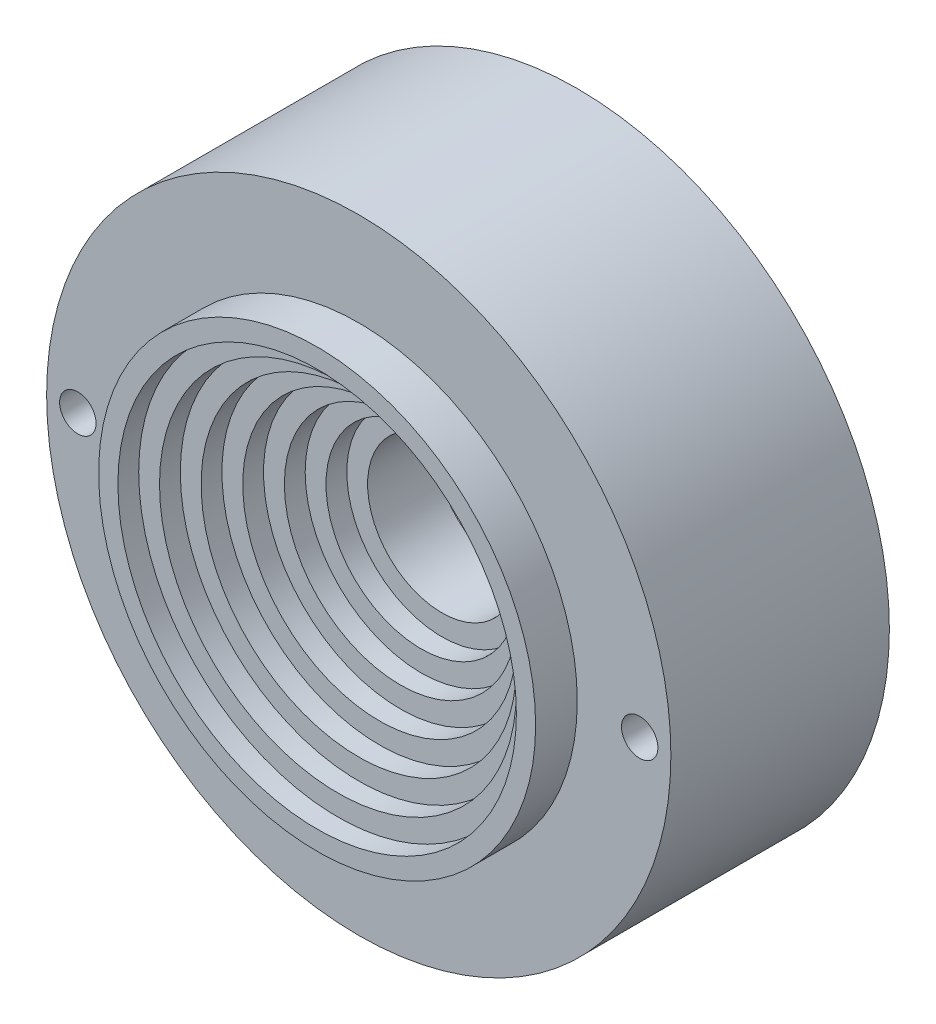
ISO-10303-21;
HEADER;
FILE_DESCRIPTION(('STEP AP214'),'2;1');
FILE_NAME('part.step','',(''),(''),'','','');
FILE_SCHEMA(('AUTOMOTIVE_DESIGN { 1 0 10303 214 1 1 1 1 }'));
ENDSEC;
DATA;
#1=APPLICATION_CONTEXT('core data for automotive mechanical design processes');
#2=APPLICATION_PROTOCOL_DEFINITION('international standard','automotive_design',2000,#1);
#3=PRODUCT_CONTEXT('',#1,'mechanical');
#4=PRODUCT('Part','Part','',(#3));
#5=PRODUCT_RELATED_PRODUCT_CATEGORY('part','',(#4));
#6=PRODUCT_DEFINITION_FORMATION('','',#4);
#7=PRODUCT_DEFINITION_CONTEXT('part definition',#1,'design');
#8=PRODUCT_DEFINITION('design','',#6,#7);
#9=PRODUCT_DEFINITION_SHAPE('','',#8);
#10=(LENGTH_UNIT() NAMED_UNIT(*) SI_UNIT(.MILLI.,.METRE.));
#11=(NAMED_UNIT(*) PLANE_ANGLE_UNIT() SI_UNIT($,.RADIAN.));
#12=(NAMED_UNIT(*) SI_UNIT($,.STERADIAN.) SOLID_ANGLE_UNIT());
#13=UNCERTAINTY_MEASURE_WITH_UNIT(LENGTH_MEASURE(1.E-05),#10,'distance_accuracy_value','');
#14=(GEOMETRIC_REPRESENTATION_CONTEXT(3) GLOBAL_UNCERTAINTY_ASSIGNED_CONTEXT((#13)) GLOBAL_UNIT_ASSIGNED_CONTEXT((#10,
#11,#12)) REPRESENTATION_CONTEXT('',''));
#15=CARTESIAN_POINT('',(0.,0.,0.));
#16=DIRECTION('',(0.,0.,1.));
#17=DIRECTION('',(1.,0.,0.));
#18=AXIS2_PLACEMENT_3D('',#15,#16,#17);
#19=CARTESIAN_POINT('',(0.,0.,0.));
#20=DIRECTION('',(0.,0.,1.));
#21=DIRECTION('',(1.,0.,0.));
#22=AXIS2_PLACEMENT_3D('',#19,#20,#21);
#23=CYLINDRICAL_SURFACE('',#22,21.);
#24=CARTESIAN_POINT('',(0.,0.,20.));
#25=DIRECTION('',(0.,0.,1.));
#26=DIRECTION('',(1.,0.,0.));
#27=AXIS2_PLACEMENT_3D('',#24,#25,#26);
#28=CIRCLE('',#27,21.);
#29=CARTESIAN_POINT('',(21.,0.,20.));
#30=VERTEX_POINT('',#29);
#31=EDGE_CURVE('E383',#30,#30,#28,.T.);
#32=ORIENTED_EDGE('',*,*,#31,.F.);
#33=EDGE_LOOP('',(#32));
#34=FACE_BOUND('',#33,.T.);
#35=CARTESIAN_POINT('',(0.,0.,16.));
#36=DIRECTION('',(0.,0.,1.));
#37=DIRECTION('',(1.,0.,0.));
#38=AXIS2_PLACEMENT_3D('',#35,#36,#37);
#39=CIRCLE('',#38,21.);
#40=CARTESIAN_POINT('',(21.,0.,16.));
#41=VERTEX_POINT('',#40);
#42=EDGE_CURVE('E310',#41,#41,#39,.T.);
#43=ORIENTED_EDGE('',*,*,#42,.T.);
#44=EDGE_LOOP('',(#43));
#45=FACE_BOUND('',#44,.T.);
#46=ADVANCED_FACE('F52',(#34,#45),#23,.T.);
#47=CARTESIAN_POINT('',(0.,19.1499999999999,20.));
#48=DIRECTION('',(0.,0.,-1.));
#49=DIRECTION('',(-1.,0.,0.));
#50=AXIS2_PLACEMENT_3D('',#47,#48,#49);
#51=PLANE('',#50);
#52=CARTESIAN_POINT('',(0.,0.,19.9999999999999));
#53=DIRECTION('',(0.,0.,1.));
#54=DIRECTION('',(1.,0.,0.));
#55=AXIS2_PLACEMENT_3D('',#52,#53,#54);
#56=CIRCLE('',#55,19.1499999999999);
#57=CARTESIAN_POINT('',(19.1499999999999,0.,19.9999999999999));
#58=VERTEX_POINT('',#57);
#59=EDGE_CURVE('E379',#58,#58,#56,.T.);
#60=ORIENTED_EDGE('',*,*,#59,.F.);
#61=EDGE_LOOP('',(#60));
#62=FACE_BOUND('',#61,.T.);
#63=ORIENTED_EDGE('',*,*,#31,.T.);
#64=EDGE_LOOP('',(#63));
#65=FACE_BOUND('',#64,.T.);
#66=ADVANCED_FACE('F480',(#62,#65),#51,.F.);
#67=CARTESIAN_POINT('',(0.,0.,0.));
#68=DIRECTION('',(0.,0.,1.));
#69=DIRECTION('',(1.,0.,0.));
#70=AXIS2_PLACEMENT_3D('',#67,#68,#69);
#71=CYLINDRICAL_SURFACE('',#70,19.1499999999999);
#72=CARTESIAN_POINT('',(0.,0.,18.));
#73=DIRECTION('',(0.,0.,1.));
#74=DIRECTION('',(1.,0.,0.));
#75=AXIS2_PLACEMENT_3D('',#72,#73,#74);
#76=CIRCLE('',#75,19.1499999999999);
#77=CARTESIAN_POINT('',(19.1499999999999,0.,18.));
#78=VERTEX_POINT('',#77);
#79=EDGE_CURVE('E375',#78,#78,#76,.T.);
#80=ORIENTED_EDGE('',*,*,#79,.F.);
#81=EDGE_LOOP('',(#80));
#82=FACE_BOUND('',#81,.T.);
#83=ORIENTED_EDGE('',*,*,#59,.T.);
#84=EDGE_LOOP('',(#83));
#85=FACE_BOUND('',#84,.T.);
#86=ADVANCED_FACE('F486',(#82,#85),#71,.F.);
#87=CARTESIAN_POINT('',(0.,17.1499999999999,18.));
#88=DIRECTION('',(0.,0.,-1.));
#89=DIRECTION('',(-1.,0.,0.));
#90=AXIS2_PLACEMENT_3D('',#87,#88,#89);
#91=PLANE('',#90);
#92=CARTESIAN_POINT('',(0.,0.,18.));
#93=DIRECTION('',(0.,0.,1.));
#94=DIRECTION('',(1.,0.,0.));
#95=AXIS2_PLACEMENT_3D('',#92,#93,#94);
#96=CIRCLE('',#95,17.1499999999999);
#97=CARTESIAN_POINT('',(17.1499999999999,0.,18.));
#98=VERTEX_POINT('',#97);
#99=EDGE_CURVE('E371',#98,#98,#96,.T.);
#100=ORIENTED_EDGE('',*,*,#99,.F.);
#101=EDGE_LOOP('',(#100));
#102=FACE_BOUND('',#101,.T.);
#103=ORIENTED_EDGE('',*,*,#79,.T.);
#104=EDGE_LOOP('',(#103));
#105=FACE_BOUND('',#104,.T.);
#106=ADVANCED_FACE('F839',(#102,#105),#91,.F.);
#107=CARTESIAN_POINT('',(0.,0.,0.));
#108=DIRECTION('',(0.,0.,1.));
#109=DIRECTION('',(1.,0.,0.));
#110=AXIS2_PLACEMENT_3D('',#107,#108,#109);
#111=CYLINDRICAL_SURFACE('',#110,17.1499999999999);
#112=CARTESIAN_POINT('',(0.,0.,16.));
#113=DIRECTION('',(0.,0.,1.));
#114=DIRECTION('',(1.,0.,0.));
#115=AXIS2_PLACEMENT_3D('',#112,#113,#114);
#116=CIRCLE('',#115,17.1499999999999);
#117=CARTESIAN_POINT('',(17.1499999999999,0.,16.));
#118=VERTEX_POINT('',#117);
#119=EDGE_CURVE('E367',#118,#118,#116,.T.);
#120=ORIENTED_EDGE('',*,*,#119,.F.);
#121=EDGE_LOOP('',(#120));
#122=FACE_BOUND('',#121,.T.);
#123=ORIENTED_EDGE('',*,*,#99,.T.);
#124=EDGE_LOOP('',(#123));
#125=FACE_BOUND('',#124,.T.);
#126=ADVANCED_FACE('F829',(#122,#125),#111,.F.);
#127=CARTESIAN_POINT('',(0.,15.15,16.));
#128=DIRECTION('',(0.,0.,-1.));
#129=DIRECTION('',(-1.,0.,0.));
#130=AXIS2_PLACEMENT_3D('',#127,#128,#129);
#131=PLANE('',#130);
#132=CARTESIAN_POINT('',(0.,0.,16.));
#133=DIRECTION('',(0.,0.,1.));
#134=DIRECTION('',(1.,0.,0.));
#135=AXIS2_PLACEMENT_3D('',#132,#133,#134);
#136=CIRCLE('',#135,15.15);
#137=CARTESIAN_POINT('',(15.15,0.,16.));
#138=VERTEX_POINT('',#137);
#139=EDGE_CURVE('E363',#138,#138,#136,.T.);
#140=ORIENTED_EDGE('',*,*,#139,.F.);
#141=EDGE_LOOP('',(#140));
#142=FACE_BOUND('',#141,.T.);
#143=ORIENTED_EDGE('',*,*,#119,.T.);
#144=EDGE_LOOP('',(#143));
#145=FACE_BOUND('',#144,.T.);
#146=ADVANCED_FACE('F819',(#142,#145),#131,.F.);
#147=CARTESIAN_POINT('',(0.,0.,0.));
#148=DIRECTION('',(0.,0.,1.));
#149=DIRECTION('',(1.,0.,0.));
#150=AXIS2_PLACEMENT_3D('',#147,#148,#149);
#151=CYLINDRICAL_SURFACE('',#150,15.15);
#152=CARTESIAN_POINT('',(0.,0.,14.));
#153=DIRECTION('',(0.,0.,1.));
#154=DIRECTION('',(1.,0.,0.));
#155=AXIS2_PLACEMENT_3D('',#152,#153,#154);
#156=CIRCLE('',#155,15.15);
#157=CARTESIAN_POINT('',(15.15,0.,14.));
#158=VERTEX_POINT('',#157);
#159=EDGE_CURVE('E359',#158,#158,#156,.T.);
#160=ORIENTED_EDGE('',*,*,#159,.F.);
#161=EDGE_LOOP('',(#160));
#162=FACE_BOUND('',#161,.T.);
#163=ORIENTED_EDGE('',*,*,#139,.T.);
#164=EDGE_LOOP('',(#163));
#165=FACE_BOUND('',#164,.T.);
#166=ADVANCED_FACE('F809',(#162,#165),#151,.F.);
#167=CARTESIAN_POINT('',(0.,13.15,14.));
#168=DIRECTION('',(0.,0.,-1.));
#169=DIRECTION('',(-1.,0.,0.));
#170=AXIS2_PLACEMENT_3D('',#167,#168,#169);
#171=PLANE('',#170);
#172=CARTESIAN_POINT('',(0.,0.,14.));
#173=DIRECTION('',(0.,0.,1.));
#174=DIRECTION('',(1.,0.,0.));
#175=AXIS2_PLACEMENT_3D('',#172,#173,#174);
#176=CIRCLE('',#175,13.15);
#177=CARTESIAN_POINT('',(13.15,0.,14.));
#178=VERTEX_POINT('',#177);
#179=EDGE_CURVE('E355',#178,#178,#176,.T.);
#180=ORIENTED_EDGE('',*,*,#179,.F.);
#181=EDGE_LOOP('',(#180));
#182=FACE_BOUND('',#181,.T.);
#183=ORIENTED_EDGE('',*,*,#159,.T.);
#184=EDGE_LOOP('',(#183));
#185=FACE_BOUND('',#184,.T.);
#186=ADVANCED_FACE('F799',(#182,#185),#171,.F.);
#187=CARTESIAN_POINT('',(0.,0.,0.));
#188=DIRECTION('',(0.,0.,1.));
#189=DIRECTION('',(1.,0.,0.));
#190=AXIS2_PLACEMENT_3D('',#187,#188,#189);
#191=CYLINDRICAL_SURFACE('',#190,13.15);
#192=CARTESIAN_POINT('',(0.,0.,12.));
#193=DIRECTION('',(0.,0.,1.));
#194=DIRECTION('',(1.,0.,0.));
#195=AXIS2_PLACEMENT_3D('',#192,#193,#194);
#196=CIRCLE('',#195,13.15);
#197=CARTESIAN_POINT('',(13.15,0.,12.));
#198=VERTEX_POINT('',#197);
#199=EDGE_CURVE('E351',#198,#198,#196,.T.);
#200=ORIENTED_EDGE('',*,*,#199,.F.);
#201=EDGE_LOOP('',(#200));
#202=FACE_BOUND('',#201,.T.);
#203=ORIENTED_EDGE('',*,*,#179,.T.);
#204=EDGE_LOOP('',(#203));
#205=FACE_BOUND('',#204,.T.);
#206=ADVANCED_FACE('F789',(#202,#205),#191,.F.);
#207=CARTESIAN_POINT('',(0.,11.15,12.));
#208=DIRECTION('',(0.,0.,-1.));
#209=DIRECTION('',(-1.,0.,0.));
#210=AXIS2_PLACEMENT_3D('',#207,#208,#209);
#211=PLANE('',#210);
#212=CARTESIAN_POINT('',(0.,0.,12.));
#213=DIRECTION('',(0.,0.,1.));
#214=DIRECTION('',(1.,0.,0.));
#215=AXIS2_PLACEMENT_3D('',#212,#213,#214);
#216=CIRCLE('',#215,11.15);
#217=CARTESIAN_POINT('',(11.15,0.,12.));
#218=VERTEX_POINT('',#217);
#219=EDGE_CURVE('E347',#218,#218,#216,.T.);
#220=ORIENTED_EDGE('',*,*,#219,.F.);
#221=EDGE_LOOP('',(#220));
#222=FACE_BOUND('',#221,.T.);
#223=ORIENTED_EDGE('',*,*,#199,.T.);
#224=EDGE_LOOP('',(#223));
#225=FACE_BOUND('',#224,.T.);
#226=ADVANCED_FACE('F779',(#222,#225),#211,.F.);
#227=CARTESIAN_POINT('',(0.,0.,0.));
#228=DIRECTION('',(0.,0.,1.));
#229=DIRECTION('',(1.,0.,0.));
#230=AXIS2_PLACEMENT_3D('',#227,#228,#229);
#231=CYLINDRICAL_SURFACE('',#230,11.15);
#232=CARTESIAN_POINT('',(0.,0.,9.99999999999999));
#233=DIRECTION('',(0.,0.,1.));
#234=DIRECTION('',(1.,0.,0.));
#235=AXIS2_PLACEMENT_3D('',#232,#233,#234);
#236=CIRCLE('',#235,11.15);
#237=CARTESIAN_POINT('',(11.15,0.,9.99999999999999));
#238=VERTEX_POINT('',#237);
#239=EDGE_CURVE('E343',#238,#238,#236,.T.);
#240=ORIENTED_EDGE('',*,*,#239,.F.);
#241=EDGE_LOOP('',(#240));
#242=FACE_BOUND('',#241,.T.);
#243=ORIENTED_EDGE('',*,*,#219,.T.);
#244=EDGE_LOOP('',(#243));
#245=FACE_BOUND('',#244,.T.);
#246=ADVANCED_FACE('F769',(#242,#245),#231,.F.);
#247=CARTESIAN_POINT('',(0.,9.14999999999998,9.99999999999999));
#248=DIRECTION('',(0.,0.,-1.));
#249=DIRECTION('',(-1.,0.,0.));
#250=AXIS2_PLACEMENT_3D('',#247,#248,#249);
#251=PLANE('',#250);
#252=CARTESIAN_POINT('',(0.,0.,9.99999999999999));
#253=DIRECTION('',(0.,0.,1.));
#254=DIRECTION('',(1.,0.,0.));
#255=AXIS2_PLACEMENT_3D('',#252,#253,#254);
#256=CIRCLE('',#255,9.14999999999998);
#257=CARTESIAN_POINT('',(9.14999999999998,0.,9.99999999999999));
#258=VERTEX_POINT('',#257);
#259=EDGE_CURVE('E339',#258,#258,#256,.T.);
#260=ORIENTED_EDGE('',*,*,#259,.F.);
#261=EDGE_LOOP('',(#260));
#262=FACE_BOUND('',#261,.T.);
#263=ORIENTED_EDGE('',*,*,#239,.T.);
#264=EDGE_LOOP('',(#263));
#265=FACE_BOUND('',#264,.T.);
#266=ADVANCED_FACE('F759',(#262,#265),#251,.F.);
#267=CARTESIAN_POINT('',(0.,0.,0.));
#268=DIRECTION('',(0.,0.,1.));
#269=DIRECTION('',(1.,0.,0.));
#270=AXIS2_PLACEMENT_3D('',#267,#268,#269);
#271=CYLINDRICAL_SURFACE('',#270,9.14999999999997);
#272=CARTESIAN_POINT('',(0.,0.,8.));
#273=DIRECTION('',(0.,0.,1.));
#274=DIRECTION('',(1.,0.,0.));
#275=AXIS2_PLACEMENT_3D('',#272,#273,#274);
#276=CIRCLE('',#275,9.14999999999997);
#277=CARTESIAN_POINT('',(9.14999999999997,0.,8.));
#278=VERTEX_POINT('',#277);
#279=EDGE_CURVE('E335',#278,#278,#276,.T.);
#280=ORIENTED_EDGE('',*,*,#279,.F.);
#281=EDGE_LOOP('',(#280));
#282=FACE_BOUND('',#281,.T.);
#283=ORIENTED_EDGE('',*,*,#259,.T.);
#284=EDGE_LOOP('',(#283));
#285=FACE_BOUND('',#284,.T.);
#286=ADVANCED_FACE('F749',(#282,#285),#271,.F.);
#287=CARTESIAN_POINT('',(0.,9.14999999999997,8.));
#288=DIRECTION('',(0.,0.,-1.));
#289=DIRECTION('',(-1.,0.,0.));
#290=AXIS2_PLACEMENT_3D('',#287,#288,#289);
#291=PLANE('',#290);
#292=CARTESIAN_POINT('',(0.,0.,8.));
#293=DIRECTION('',(0.,0.,1.));
#294=DIRECTION('',(1.,0.,0.));
#295=AXIS2_PLACEMENT_3D('',#292,#293,#294);
#296=CIRCLE('',#295,7.15);
#297=CARTESIAN_POINT('',(7.15,0.,8.));
#298=VERTEX_POINT('',#297);
#299=EDGE_CURVE('E331',#298,#298,#296,.T.);
#300=ORIENTED_EDGE('',*,*,#299,.F.);
#301=EDGE_LOOP('',(#300));
#302=FACE_BOUND('',#301,.T.);
#303=ORIENTED_EDGE('',*,*,#279,.T.);
#304=EDGE_LOOP('',(#303));
#305=FACE_BOUND('',#304,.T.);
#306=ADVANCED_FACE('F568',(#302,#305),#291,.F.);
#307=CARTESIAN_POINT('',(0.,0.,0.));
#308=DIRECTION('',(0.,0.,1.));
#309=DIRECTION('',(1.,0.,0.));
#310=AXIS2_PLACEMENT_3D('',#307,#308,#309);
#311=CYLINDRICAL_SURFACE('',#310,7.15);
#312=CARTESIAN_POINT('',(0.,0.,1.5));
#313=DIRECTION('',(0.,0.,1.));
#314=DIRECTION('',(1.,0.,0.));
#315=AXIS2_PLACEMENT_3D('',#312,#313,#314);
#316=CIRCLE('',#315,7.15);
#317=CARTESIAN_POINT('',(7.15,0.,1.5));
#318=VERTEX_POINT('',#317);
#319=EDGE_CURVE('E56',#318,#318,#316,.F.);
#320=ORIENTED_EDGE('',*,*,#319,.T.);
#321=EDGE_LOOP('',(#320));
#322=FACE_BOUND('',#321,.T.);
#323=ORIENTED_EDGE('',*,*,#299,.T.);
#324=EDGE_LOOP('',(#323));
#325=FACE_BOUND('',#324,.T.);
#326=ADVANCED_FACE('F563',(#322,#325),#311,.F.);
#327=CARTESIAN_POINT('',(0.,30.,0.));
#328=DIRECTION('',(0.,0.,1.));
#329=DIRECTION('',(1.,0.,0.));
#330=AXIS2_PLACEMENT_3D('',#327,#328,#329);
#331=PLANE('',#330);
#332=DIRECTION('',(1.,0.,0.));
#333=VECTOR('',#332,1.);
#334=CARTESIAN_POINT('',(12.15,8.65,0.));
#335=LINE('',#334,#333);
#336=CARTESIAN_POINT('',(-12.15,8.65000000000001,0.));
#337=VERTEX_POINT('',#336);
#338=CARTESIAN_POINT('',(12.15,8.65,0.));
#339=VERTEX_POINT('',#338);
#340=EDGE_CURVE('E231',#337,#339,#335,.T.);
#341=ORIENTED_EDGE('',*,*,#340,.F.);
#342=CARTESIAN_POINT('',(-12.15,6.65,0.));
#343=DIRECTION('',(0.,0.,-1.));
#344=DIRECTION('',(1.,0.,0.));
#345=AXIS2_PLACEMENT_3D('',#342,#343,#344);
#346=CIRCLE('',#345,2.);
#347=CARTESIAN_POINT('',(-14.15,6.65,0.));
#348=VERTEX_POINT('',#347);
#349=EDGE_CURVE('E72',#348,#337,#346,.T.);
#350=ORIENTED_EDGE('',*,*,#349,.F.);
#351=DIRECTION('',(0.,1.,0.));
#352=VECTOR('',#351,1.);
#353=CARTESIAN_POINT('',(-14.15,-6.65,0.));
#354=LINE('',#353,#352);
#355=CARTESIAN_POINT('',(-14.15,-6.65,0.));
#356=VERTEX_POINT('',#355);
#357=EDGE_CURVE('E203',#356,#348,#354,.T.);
#358=ORIENTED_EDGE('',*,*,#357,.F.);
#359=CARTESIAN_POINT('',(-12.15,-6.65,0.));
#360=DIRECTION('',(0.,0.,-1.));
#361=DIRECTION('',(-1.,0.,0.));
#362=AXIS2_PLACEMENT_3D('',#359,#360,#361);
#363=CIRCLE('',#362,2.);
#364=CARTESIAN_POINT('',(-12.15,-8.65,0.));
#365=VERTEX_POINT('',#364);
#366=EDGE_CURVE('E207',#365,#356,#363,.T.);
#367=ORIENTED_EDGE('',*,*,#366,.F.);
#368=DIRECTION('',(-1.,0.,0.));
#369=VECTOR('',#368,1.);
#370=CARTESIAN_POINT('',(12.15,-8.65,0.));
#371=LINE('',#370,#369);
#372=CARTESIAN_POINT('',(12.15,-8.65,0.));
#373=VERTEX_POINT('',#372);
#374=EDGE_CURVE('E246',#373,#365,#371,.T.);
#375=ORIENTED_EDGE('',*,*,#374,.F.);
#376=CARTESIAN_POINT('',(12.15,-6.65,0.));
#377=DIRECTION('',(0.,0.,-1.));
#378=DIRECTION('',(1.,0.,0.));
#379=AXIS2_PLACEMENT_3D('',#376,#377,#378);
#380=CIRCLE('',#379,2.);
#381=CARTESIAN_POINT('',(14.15,-6.65,0.));
#382=VERTEX_POINT('',#381);
#383=EDGE_CURVE('E242',#382,#373,#380,.T.);
#384=ORIENTED_EDGE('',*,*,#383,.F.);
#385=DIRECTION('',(0.,-1.,0.));
#386=VECTOR('',#385,1.);
#387=CARTESIAN_POINT('',(14.15,-6.65,0.));
#388=LINE('',#387,#386);
#389=CARTESIAN_POINT('',(14.15,6.65,0.));
#390=VERTEX_POINT('',#389);
#391=EDGE_CURVE('E238',#390,#382,#388,.T.);
#392=ORIENTED_EDGE('',*,*,#391,.F.);
#393=CARTESIAN_POINT('',(12.15,6.65,0.));
#394=DIRECTION('',(0.,0.,-1.));
#395=DIRECTION('',(1.,0.,0.));
#396=AXIS2_PLACEMENT_3D('',#393,#394,#395);
#397=CIRCLE('',#396,2.);
#398=EDGE_CURVE('E234',#339,#390,#397,.T.);
#399=ORIENTED_EDGE('',*,*,#398,.F.);
#400=EDGE_LOOP('',(#341,#350,#358,#367,#375,#384,#392,#399));
#401=FACE_BOUND('',#400,.T.);
#402=DIRECTION('',(0.,1.,0.));
#403=VECTOR('',#402,1.);
#404=CARTESIAN_POINT('',(16.,0.,0.));
#405=LINE('',#404,#403);
#406=CARTESIAN_POINT('',(16.,-14.,0.));
#407=VERTEX_POINT('',#406);
#408=CARTESIAN_POINT('',(16.,14.,0.));
#409=VERTEX_POINT('',#408);
#410=EDGE_CURVE('E318',#407,#409,#405,.T.);
#411=ORIENTED_EDGE('',*,*,#410,.F.);
#412=CARTESIAN_POINT('',(14.,-14.,0.));
#413=DIRECTION('',(0.,0.,1.));
#414=DIRECTION('',(1.,0.,0.));
#415=AXIS2_PLACEMENT_3D('',#412,#413,#414);
#416=CIRCLE('',#415,2.);
#417=CARTESIAN_POINT('',(14.,-16.,0.));
#418=VERTEX_POINT('',#417);
#419=EDGE_CURVE('E403',#407,#418,#416,.F.);
#420=ORIENTED_EDGE('',*,*,#419,.T.);
#421=DIRECTION('',(-1.,0.,0.));
#422=VECTOR('',#421,1.);
#423=CARTESIAN_POINT('',(0.,-16.,0.));
#424=LINE('',#423,#422);
#425=CARTESIAN_POINT('',(-14.,-16.,0.));
#426=VERTEX_POINT('',#425);
#427=EDGE_CURVE('E314',#418,#426,#424,.T.);
#428=ORIENTED_EDGE('',*,*,#427,.T.);
#429=CARTESIAN_POINT('',(-14.,-14.,0.));
#430=DIRECTION('',(0.,0.,1.));
#431=DIRECTION('',(1.,0.,0.));
#432=AXIS2_PLACEMENT_3D('',#429,#430,#431);
#433=CIRCLE('',#432,2.);
#434=CARTESIAN_POINT('',(-16.,-14.,0.));
#435=VERTEX_POINT('',#434);
#436=EDGE_CURVE('E400',#426,#435,#433,.F.);
#437=ORIENTED_EDGE('',*,*,#436,.T.);
#438=DIRECTION('',(0.,1.,0.));
#439=VECTOR('',#438,1.);
#440=CARTESIAN_POINT('',(-16.,0.,0.));
#441=LINE('',#440,#439);
#442=CARTESIAN_POINT('',(-16.,14.,0.));
#443=VERTEX_POINT('',#442);
#444=EDGE_CURVE('E289',#435,#443,#441,.T.);
#445=ORIENTED_EDGE('',*,*,#444,.T.);
#446=CARTESIAN_POINT('',(-14.,14.,0.));
#447=DIRECTION('',(0.,0.,1.));
#448=DIRECTION('',(1.,0.,0.));
#449=AXIS2_PLACEMENT_3D('',#446,#447,#448);
#450=CIRCLE('',#449,2.);
#451=CARTESIAN_POINT('',(-14.,16.,0.));
#452=VERTEX_POINT('',#451);
#453=EDGE_CURVE('E394',#443,#452,#450,.F.);
#454=ORIENTED_EDGE('',*,*,#453,.T.);
#455=DIRECTION('',(-1.,0.,0.));
#456=VECTOR('',#455,1.);
#457=CARTESIAN_POINT('',(0.,16.,0.));
#458=LINE('',#457,#456);
#459=CARTESIAN_POINT('',(14.,16.,0.));
#460=VERTEX_POINT('',#459);
#461=EDGE_CURVE('E295',#460,#452,#458,.T.);
#462=ORIENTED_EDGE('',*,*,#461,.F.);
#463=CARTESIAN_POINT('',(14.,14.,0.));
#464=DIRECTION('',(0.,0.,1.));
#465=DIRECTION('',(1.,0.,0.));
#466=AXIS2_PLACEMENT_3D('',#463,#464,#465);
#467=CIRCLE('',#466,2.);
#468=EDGE_CURVE('E397',#460,#409,#467,.F.);
#469=ORIENTED_EDGE('',*,*,#468,.T.);
#470=EDGE_LOOP('',(#411,#420,#428,#437,#445,#454,#462,#469));
#471=FACE_BOUND('',#470,.T.);
#472=ADVANCED_FACE('F448',(#401,#471),#331,.F.);
#473=CARTESIAN_POINT('',(0.,0.,0.));
#474=DIRECTION('',(0.,0.,1.));
#475=DIRECTION('',(1.,0.,0.));
#476=AXIS2_PLACEMENT_3D('',#473,#474,#475);
#477=CYLINDRICAL_SURFACE('',#476,30.);
#478=CARTESIAN_POINT('',(0.,0.,16.));
#479=DIRECTION('',(0.,0.,1.));
#480=DIRECTION('',(1.,0.,0.));
#481=AXIS2_PLACEMENT_3D('',#478,#479,#480);
#482=CIRCLE('',#481,30.);
#483=CARTESIAN_POINT('',(30.,0.,16.));
#484=VERTEX_POINT('',#483);
#485=EDGE_CURVE('E327',#484,#484,#482,.T.);
#486=ORIENTED_EDGE('',*,*,#485,.F.);
#487=EDGE_LOOP('',(#486));
#488=FACE_BOUND('',#487,.T.);
#489=CARTESIAN_POINT('',(0.,0.,-5.));
#490=DIRECTION('',(0.,0.,-1.));
#491=DIRECTION('',(-1.,0.,0.));
#492=AXIS2_PLACEMENT_3D('',#489,#490,#491);
#493=CIRCLE('',#492,30.);
#494=CARTESIAN_POINT('',(-30.,0.,-5.));
#495=VERTEX_POINT('',#494);
#496=EDGE_CURVE('E306',#495,#495,#493,.T.);
#497=ORIENTED_EDGE('',*,*,#496,.F.);
#498=EDGE_LOOP('',(#497));
#499=FACE_BOUND('',#498,.T.);
#500=ADVANCED_FACE('F523',(#488,#499),#477,.T.);
#501=CARTESIAN_POINT('',(0.,21.,16.));
#502=DIRECTION('',(0.,0.,-1.));
#503=DIRECTION('',(-1.,0.,0.));
#504=AXIS2_PLACEMENT_3D('',#501,#502,#503);
#505=PLANE('',#504);
#506=CARTESIAN_POINT('',(27.,0.,16.));
#507=DIRECTION('',(0.,0.,-1.));
#508=DIRECTION('',(-1.,0.,0.));
#509=AXIS2_PLACEMENT_3D('',#506,#507,#508);
#510=CIRCLE('',#509,1.75);
#511=CARTESIAN_POINT('',(25.25,0.,16.));
#512=VERTEX_POINT('',#511);
#513=EDGE_CURVE('E285',#512,#512,#510,.T.);
#514=ORIENTED_EDGE('',*,*,#513,.T.);
#515=EDGE_LOOP('',(#514));
#516=FACE_BOUND('',#515,.T.);
#517=CARTESIAN_POINT('',(-27.,0.,16.));
#518=DIRECTION('',(0.,0.,-1.));
#519=DIRECTION('',(-1.,0.,0.));
#520=AXIS2_PLACEMENT_3D('',#517,#518,#519);
#521=CIRCLE('',#520,1.75);
#522=CARTESIAN_POINT('',(-28.75,0.,16.));
#523=VERTEX_POINT('',#522);
#524=EDGE_CURVE('E277',#523,#523,#521,.T.);
#525=ORIENTED_EDGE('',*,*,#524,.T.);
#526=EDGE_LOOP('',(#525));
#527=FACE_BOUND('',#526,.T.);
#528=ORIENTED_EDGE('',*,*,#42,.F.);
#529=EDGE_LOOP('',(#528));
#530=FACE_BOUND('',#529,.T.);
#531=ORIENTED_EDGE('',*,*,#485,.T.);
#532=EDGE_LOOP('',(#531));
#533=FACE_BOUND('',#532,.T.);
#534=ADVANCED_FACE('F517',(#516,#527,#530,#533),#505,.F.);
#535=CARTESIAN_POINT('',(-16.,0.,-5.));
#536=DIRECTION('',(1.,0.,0.));
#537=DIRECTION('',(0.,0.,-1.));
#538=AXIS2_PLACEMENT_3D('',#535,#536,#537);
#539=PLANE('',#538);
#540=ORIENTED_EDGE('',*,*,#444,.F.);
#541=DIRECTION('',(0.,0.,1.));
#542=VECTOR('',#541,1.);
#543=CARTESIAN_POINT('',(-16.,-14.,-5.));
#544=LINE('',#543,#542);
#545=CARTESIAN_POINT('',(-16.,-14.,-5.));
#546=VERTEX_POINT('',#545);
#547=EDGE_CURVE('E417',#435,#546,#544,.F.);
#548=ORIENTED_EDGE('',*,*,#547,.T.);
#549=DIRECTION('',(0.,1.,0.));
#550=VECTOR('',#549,1.);
#551=CARTESIAN_POINT('',(-16.,0.,-5.));
#552=LINE('',#551,#550);
#553=CARTESIAN_POINT('',(-16.,14.,-5.));
#554=VERTEX_POINT('',#553);
#555=EDGE_CURVE('E290',#546,#554,#552,.T.);
#556=ORIENTED_EDGE('',*,*,#555,.T.);
#557=DIRECTION('',(0.,0.,1.));
#558=VECTOR('',#557,1.);
#559=CARTESIAN_POINT('',(-16.,14.,-5.));
#560=LINE('',#559,#558);
#561=EDGE_CURVE('E413',#554,#443,#560,.T.);
#562=ORIENTED_EDGE('',*,*,#561,.T.);
#563=EDGE_LOOP('',(#540,#548,#556,#562));
#564=FACE_BOUND('',#563,.T.);
#565=ADVANCED_FACE('F467',(#564),#539,.T.);
#566=CARTESIAN_POINT('',(0.,-16.,-5.));
#567=DIRECTION('',(0.,1.,0.));
#568=DIRECTION('',(0.,0.,1.));
#569=AXIS2_PLACEMENT_3D('',#566,#567,#568);
#570=PLANE('',#569);
#571=ORIENTED_EDGE('',*,*,#427,.F.);
#572=DIRECTION('',(0.,0.,1.));
#573=VECTOR('',#572,1.);
#574=CARTESIAN_POINT('',(14.,-16.,-5.));
#575=LINE('',#574,#573);
#576=CARTESIAN_POINT('',(14.,-16.,-5.));
#577=VERTEX_POINT('',#576);
#578=EDGE_CURVE('E410',#418,#577,#575,.F.);
#579=ORIENTED_EDGE('',*,*,#578,.T.);
#580=DIRECTION('',(-1.,0.,0.));
#581=VECTOR('',#580,1.);
#582=CARTESIAN_POINT('',(0.,-16.,-5.));
#583=LINE('',#582,#581);
#584=CARTESIAN_POINT('',(-14.,-16.,-5.));
#585=VERTEX_POINT('',#584);
#586=EDGE_CURVE('E294',#577,#585,#583,.T.);
#587=ORIENTED_EDGE('',*,*,#586,.T.);
#588=DIRECTION('',(0.,0.,1.));
#589=VECTOR('',#588,1.);
#590=CARTESIAN_POINT('',(-14.,-16.,0.));
#591=LINE('',#590,#589);
#592=EDGE_CURVE('E406',#585,#426,#591,.T.);
#593=ORIENTED_EDGE('',*,*,#592,.T.);
#594=EDGE_LOOP('',(#571,#579,#587,#593));
#595=FACE_BOUND('',#594,.T.);
#596=ADVANCED_FACE('F458',(#595),#570,.T.);
#597=CARTESIAN_POINT('',(16.,0.,-5.));
#598=DIRECTION('',(1.,0.,0.));
#599=DIRECTION('',(0.,0.,-1.));
#600=AXIS2_PLACEMENT_3D('',#597,#598,#599);
#601=PLANE('',#600);
#602=DIRECTION('',(0.,1.,0.));
#603=VECTOR('',#602,1.);
#604=CARTESIAN_POINT('',(16.,0.,-5.));
#605=LINE('',#604,#603);
#606=CARTESIAN_POINT('',(16.,-14.,-5.));
#607=VERTEX_POINT('',#606);
#608=CARTESIAN_POINT('',(16.,14.,-5.));
#609=VERTEX_POINT('',#608);
#610=EDGE_CURVE('E299',#607,#609,#605,.T.);
#611=ORIENTED_EDGE('',*,*,#610,.F.);
#612=DIRECTION('',(0.,0.,1.));
#613=VECTOR('',#612,1.);
#614=CARTESIAN_POINT('',(16.,-14.,-5.));
#615=LINE('',#614,#613);
#616=EDGE_CURVE('E390',#607,#407,#615,.T.);
#617=ORIENTED_EDGE('',*,*,#616,.T.);
#618=ORIENTED_EDGE('',*,*,#410,.T.);
#619=DIRECTION('',(0.,0.,1.));
#620=VECTOR('',#619,1.);
#621=CARTESIAN_POINT('',(16.,14.,-5.));
#622=LINE('',#621,#620);
#623=EDGE_CURVE('E387',#409,#609,#622,.F.);
#624=ORIENTED_EDGE('',*,*,#623,.T.);
#625=EDGE_LOOP('',(#611,#617,#618,#624));
#626=FACE_BOUND('',#625,.T.);
#627=ADVANCED_FACE('F450',(#626),#601,.F.);
#628=CARTESIAN_POINT('',(0.,16.,-5.));
#629=DIRECTION('',(0.,1.,0.));
#630=DIRECTION('',(0.,0.,1.));
#631=AXIS2_PLACEMENT_3D('',#628,#629,#630);
#632=PLANE('',#631);
#633=DIRECTION('',(-1.,0.,0.));
#634=VECTOR('',#633,1.);
#635=CARTESIAN_POINT('',(0.,16.,-5.));
#636=LINE('',#635,#634);
#637=CARTESIAN_POINT('',(14.,16.,-5.));
#638=VERTEX_POINT('',#637);
#639=CARTESIAN_POINT('',(-14.,16.,-5.));
#640=VERTEX_POINT('',#639);
#641=EDGE_CURVE('E303',#638,#640,#636,.T.);
#642=ORIENTED_EDGE('',*,*,#641,.F.);
#643=DIRECTION('',(0.,0.,1.));
#644=VECTOR('',#643,1.);
#645=CARTESIAN_POINT('',(14.,16.,0.));
#646=LINE('',#645,#644);
#647=EDGE_CURVE('E422',#638,#460,#646,.T.);
#648=ORIENTED_EDGE('',*,*,#647,.T.);
#649=ORIENTED_EDGE('',*,*,#461,.T.);
#650=DIRECTION('',(0.,0.,1.));
#651=VECTOR('',#650,1.);
#652=CARTESIAN_POINT('',(-14.,16.,-5.));
#653=LINE('',#652,#651);
#654=EDGE_CURVE('E82',#452,#640,#653,.F.);
#655=ORIENTED_EDGE('',*,*,#654,.T.);
#656=EDGE_LOOP('',(#642,#648,#649,#655));
#657=FACE_BOUND('',#656,.T.);
#658=ADVANCED_FACE('F443',(#657),#632,.F.);
#659=CARTESIAN_POINT('',(0.,0.,-5.));
#660=DIRECTION('',(0.,0.,-1.));
#661=DIRECTION('',(-1.,0.,0.));
#662=AXIS2_PLACEMENT_3D('',#659,#660,#661);
#663=PLANE('',#662);
#664=CARTESIAN_POINT('',(27.,0.,-5.));
#665=DIRECTION('',(0.,0.,-1.));
#666=DIRECTION('',(-1.,0.,0.));
#667=AXIS2_PLACEMENT_3D('',#664,#665,#666);
#668=CIRCLE('',#667,1.75);
#669=CARTESIAN_POINT('',(25.25,0.,-5.));
#670=VERTEX_POINT('',#669);
#671=EDGE_CURVE('E273',#670,#670,#668,.T.);
#672=ORIENTED_EDGE('',*,*,#671,.F.);
#673=EDGE_LOOP('',(#672));
#674=FACE_BOUND('',#673,.T.);
#675=CARTESIAN_POINT('',(-27.,0.,-5.));
#676=DIRECTION('',(0.,0.,-1.));
#677=DIRECTION('',(-1.,0.,0.));
#678=AXIS2_PLACEMENT_3D('',#675,#676,#677);
#679=CIRCLE('',#678,1.75);
#680=CARTESIAN_POINT('',(-28.75,0.,-5.));
#681=VERTEX_POINT('',#680);
#682=EDGE_CURVE('E278',#681,#681,#679,.T.);
#683=ORIENTED_EDGE('',*,*,#682,.F.);
#684=EDGE_LOOP('',(#683));
#685=FACE_BOUND('',#684,.T.);
#686=ORIENTED_EDGE('',*,*,#555,.F.);
#687=CARTESIAN_POINT('',(-14.,-14.,-5.));
#688=DIRECTION('',(0.,0.,-1.));
#689=DIRECTION('',(-1.,0.,0.));
#690=AXIS2_PLACEMENT_3D('',#687,#688,#689);
#691=CIRCLE('',#690,2.);
#692=EDGE_CURVE('E429',#546,#585,#691,.F.);
#693=ORIENTED_EDGE('',*,*,#692,.T.);
#694=ORIENTED_EDGE('',*,*,#586,.F.);
#695=CARTESIAN_POINT('',(14.,-14.,-5.));
#696=DIRECTION('',(0.,0.,-1.));
#697=DIRECTION('',(-1.,0.,0.));
#698=AXIS2_PLACEMENT_3D('',#695,#696,#697);
#699=CIRCLE('',#698,2.);
#700=EDGE_CURVE('E426',#577,#607,#699,.F.);
#701=ORIENTED_EDGE('',*,*,#700,.T.);
#702=ORIENTED_EDGE('',*,*,#610,.T.);
#703=CARTESIAN_POINT('',(14.,14.,-5.));
#704=DIRECTION('',(0.,0.,-1.));
#705=DIRECTION('',(-1.,0.,0.));
#706=AXIS2_PLACEMENT_3D('',#703,#704,#705);
#707=CIRCLE('',#706,2.);
#708=EDGE_CURVE('E62',#609,#638,#707,.F.);
#709=ORIENTED_EDGE('',*,*,#708,.T.);
#710=ORIENTED_EDGE('',*,*,#641,.T.);
#711=CARTESIAN_POINT('',(-14.,14.,-5.));
#712=DIRECTION('',(0.,0.,-1.));
#713=DIRECTION('',(-1.,0.,0.));
#714=AXIS2_PLACEMENT_3D('',#711,#712,#713);
#715=CIRCLE('',#714,2.);
#716=EDGE_CURVE('E11',#640,#554,#715,.F.);
#717=ORIENTED_EDGE('',*,*,#716,.T.);
#718=EDGE_LOOP('',(#686,#693,#694,#701,#702,#709,#710,#717));
#719=FACE_BOUND('',#718,.T.);
#720=ORIENTED_EDGE('',*,*,#496,.T.);
#721=EDGE_LOOP('',(#720));
#722=FACE_BOUND('',#721,.T.);
#723=ADVANCED_FACE('F436',(#674,#685,#719,#722),#663,.T.);
#724=CARTESIAN_POINT('',(14.,-14.,-5.));
#725=DIRECTION('',(0.,0.,1.));
#726=DIRECTION('',(1.,0.,0.));
#727=AXIS2_PLACEMENT_3D('',#724,#725,#726);
#728=CYLINDRICAL_SURFACE('',#727,2.);
#729=ORIENTED_EDGE('',*,*,#700,.F.);
#730=ORIENTED_EDGE('',*,*,#578,.F.);
#731=ORIENTED_EDGE('',*,*,#419,.F.);
#732=ORIENTED_EDGE('',*,*,#616,.F.);
#733=EDGE_LOOP('',(#729,#730,#731,#732));
#734=FACE_BOUND('',#733,.T.);
#735=ADVANCED_FACE('F454',(#734),#728,.F.);
#736=CARTESIAN_POINT('',(-14.,-14.,-5.));
#737=DIRECTION('',(0.,0.,-1.));
#738=DIRECTION('',(-1.,0.,0.));
#739=AXIS2_PLACEMENT_3D('',#736,#737,#738);
#740=CYLINDRICAL_SURFACE('',#739,2.);
#741=ORIENTED_EDGE('',*,*,#692,.F.);
#742=ORIENTED_EDGE('',*,*,#547,.F.);
#743=ORIENTED_EDGE('',*,*,#436,.F.);
#744=ORIENTED_EDGE('',*,*,#592,.F.);
#745=EDGE_LOOP('',(#741,#742,#743,#744));
#746=FACE_BOUND('',#745,.T.);
#747=ADVANCED_FACE('F463',(#746),#740,.F.);
#748=CARTESIAN_POINT('',(14.,14.,-5.));
#749=DIRECTION('',(0.,0.,-1.));
#750=DIRECTION('',(-1.,0.,0.));
#751=AXIS2_PLACEMENT_3D('',#748,#749,#750);
#752=CYLINDRICAL_SURFACE('',#751,2.);
#753=ORIENTED_EDGE('',*,*,#708,.F.);
#754=ORIENTED_EDGE('',*,*,#623,.F.);
#755=ORIENTED_EDGE('',*,*,#468,.F.);
#756=ORIENTED_EDGE('',*,*,#647,.F.);
#757=EDGE_LOOP('',(#753,#754,#755,#756));
#758=FACE_BOUND('',#757,.T.);
#759=ADVANCED_FACE('F445',(#758),#752,.F.);
#760=CARTESIAN_POINT('',(-14.,14.,-5.));
#761=DIRECTION('',(0.,0.,1.));
#762=DIRECTION('',(1.,0.,0.));
#763=AXIS2_PLACEMENT_3D('',#760,#761,#762);
#764=CYLINDRICAL_SURFACE('',#763,2.);
#765=ORIENTED_EDGE('',*,*,#716,.F.);
#766=ORIENTED_EDGE('',*,*,#654,.F.);
#767=ORIENTED_EDGE('',*,*,#453,.F.);
#768=ORIENTED_EDGE('',*,*,#561,.F.);
#769=EDGE_LOOP('',(#765,#766,#767,#768));
#770=FACE_BOUND('',#769,.T.);
#771=ADVANCED_FACE('F54',(#770),#764,.F.);
#772=CARTESIAN_POINT('',(-27.,0.,20.));
#773=DIRECTION('',(0.,0.,-1.));
#774=DIRECTION('',(-1.,0.,0.));
#775=AXIS2_PLACEMENT_3D('',#772,#773,#774);
#776=CYLINDRICAL_SURFACE('',#775,1.75);
#777=ORIENTED_EDGE('',*,*,#682,.T.);
#778=EDGE_LOOP('',(#777));
#779=FACE_BOUND('',#778,.T.);
#780=ORIENTED_EDGE('',*,*,#524,.F.);
#781=EDGE_LOOP('',(#780));
#782=FACE_BOUND('',#781,.T.);
#783=ADVANCED_FACE('F471',(#779,#782),#776,.F.);
#784=CARTESIAN_POINT('',(27.,0.,20.));
#785=DIRECTION('',(0.,0.,-1.));
#786=DIRECTION('',(-1.,0.,0.));
#787=AXIS2_PLACEMENT_3D('',#784,#785,#786);
#788=CYLINDRICAL_SURFACE('',#787,1.75);
#789=ORIENTED_EDGE('',*,*,#671,.T.);
#790=EDGE_LOOP('',(#789));
#791=FACE_BOUND('',#790,.T.);
#792=ORIENTED_EDGE('',*,*,#513,.F.);
#793=EDGE_LOOP('',(#792));
#794=FACE_BOUND('',#793,.T.);
#795=ADVANCED_FACE('F476',(#791,#794),#788,.F.);
#796=CARTESIAN_POINT('',(-12.15,6.65,1.5));
#797=DIRECTION('',(0.,0.,1.));
#798=DIRECTION('',(1.,0.,0.));
#799=AXIS2_PLACEMENT_3D('',#796,#797,#798);
#800=PLANE('',#799);
#801=CARTESIAN_POINT('',(-12.15,6.65,1.5));
#802=DIRECTION('',(0.,0.,-1.));
#803=DIRECTION('',(1.,0.,0.));
#804=AXIS2_PLACEMENT_3D('',#801,#802,#803);
#805=CIRCLE('',#804,2.);
#806=CARTESIAN_POINT('',(-14.15,6.65,1.5));
#807=VERTEX_POINT('',#806);
#808=CARTESIAN_POINT('',(-12.15,8.65,1.5));
#809=VERTEX_POINT('',#808);
#810=EDGE_CURVE('E180',#807,#809,#805,.T.);
#811=ORIENTED_EDGE('',*,*,#810,.T.);
#812=DIRECTION('',(1.,0.,0.));
#813=VECTOR('',#812,1.);
#814=CARTESIAN_POINT('',(12.15,8.65,1.5));
#815=LINE('',#814,#813);
#816=CARTESIAN_POINT('',(12.15,8.65,1.5));
#817=VERTEX_POINT('',#816);
#818=EDGE_CURVE('E190',#809,#817,#815,.T.);
#819=ORIENTED_EDGE('',*,*,#818,.T.);
#820=CARTESIAN_POINT('',(12.15,6.65,1.5));
#821=DIRECTION('',(0.,0.,-1.));
#822=DIRECTION('',(1.,0.,0.));
#823=AXIS2_PLACEMENT_3D('',#820,#821,#822);
#824=CIRCLE('',#823,2.);
#825=CARTESIAN_POINT('',(14.15,6.65,1.5));
#826=VERTEX_POINT('',#825);
#827=EDGE_CURVE('E196',#817,#826,#824,.T.);
#828=ORIENTED_EDGE('',*,*,#827,.T.);
#829=DIRECTION('',(0.,-1.,0.));
#830=VECTOR('',#829,1.);
#831=CARTESIAN_POINT('',(14.15,-6.65,1.5));
#832=LINE('',#831,#830);
#833=CARTESIAN_POINT('',(14.15,-6.65,1.5));
#834=VERTEX_POINT('',#833);
#835=EDGE_CURVE('E212',#826,#834,#832,.T.);
#836=ORIENTED_EDGE('',*,*,#835,.T.);
#837=CARTESIAN_POINT('',(12.15,-6.65,1.5));
#838=DIRECTION('',(0.,0.,-1.));
#839=DIRECTION('',(1.,0.,0.));
#840=AXIS2_PLACEMENT_3D('',#837,#838,#839);
#841=CIRCLE('',#840,2.);
#842=CARTESIAN_POINT('',(12.15,-8.65,1.5));
#843=VERTEX_POINT('',#842);
#844=EDGE_CURVE('E216',#834,#843,#841,.T.);
#845=ORIENTED_EDGE('',*,*,#844,.T.);
#846=DIRECTION('',(-1.,0.,0.));
#847=VECTOR('',#846,1.);
#848=CARTESIAN_POINT('',(12.15,-8.65,1.5));
#849=LINE('',#848,#847);
#850=CARTESIAN_POINT('',(-12.15,-8.65,1.5));
#851=VERTEX_POINT('',#850);
#852=EDGE_CURVE('E220',#843,#851,#849,.T.);
#853=ORIENTED_EDGE('',*,*,#852,.T.);
#854=CARTESIAN_POINT('',(-12.15,-6.65,1.5));
#855=DIRECTION('',(0.,0.,-1.));
#856=DIRECTION('',(-1.,0.,0.));
#857=AXIS2_PLACEMENT_3D('',#854,#855,#856);
#858=CIRCLE('',#857,2.);
#859=CARTESIAN_POINT('',(-14.15,-6.65,1.5));
#860=VERTEX_POINT('',#859);
#861=EDGE_CURVE('E224',#851,#860,#858,.T.);
#862=ORIENTED_EDGE('',*,*,#861,.T.);
#863=DIRECTION('',(0.,1.,0.));
#864=VECTOR('',#863,1.);
#865=CARTESIAN_POINT('',(-14.15,-6.65,1.5));
#866=LINE('',#865,#864);
#867=EDGE_CURVE('E187',#860,#807,#866,.T.);
#868=ORIENTED_EDGE('',*,*,#867,.T.);
#869=EDGE_LOOP('',(#811,#819,#828,#836,#845,#853,#862,#868));
#870=FACE_BOUND('',#869,.T.);
#871=ORIENTED_EDGE('',*,*,#319,.F.);
#872=EDGE_LOOP('',(#871));
#873=FACE_BOUND('',#872,.T.);
#874=ADVANCED_FACE('F198',(#870,#873),#800,.F.);
#875=CARTESIAN_POINT('',(-12.15,6.65,1.5));
#876=DIRECTION('',(0.,0.,-1.));
#877=DIRECTION('',(-1.,0.,0.));
#878=AXIS2_PLACEMENT_3D('',#875,#876,#877);
#879=CYLINDRICAL_SURFACE('',#878,2.);
#880=ORIENTED_EDGE('',*,*,#349,.T.);
#881=DIRECTION('',(0.,0.,-1.));
#882=VECTOR('',#881,1.);
#883=CARTESIAN_POINT('',(-12.15,8.65,1.5));
#884=LINE('',#883,#882);
#885=EDGE_CURVE('E176',#809,#337,#884,.T.);
#886=ORIENTED_EDGE('',*,*,#885,.F.);
#887=ORIENTED_EDGE('',*,*,#810,.F.);
#888=DIRECTION('',(0.,0.,-1.));
#889=VECTOR('',#888,1.);
#890=CARTESIAN_POINT('',(-14.15,6.65,1.5));
#891=LINE('',#890,#889);
#892=EDGE_CURVE('E253',#807,#348,#891,.T.);
#893=ORIENTED_EDGE('',*,*,#892,.T.);
#894=EDGE_LOOP('',(#880,#886,#887,#893));
#895=FACE_BOUND('',#894,.T.);
#896=ADVANCED_FACE('F178',(#895),#879,.F.);
#897=CARTESIAN_POINT('',(-14.15,-6.65,1.5));
#898=DIRECTION('',(-1.,0.,0.));
#899=DIRECTION('',(0.,0.,1.));
#900=AXIS2_PLACEMENT_3D('',#897,#898,#899);
#901=PLANE('',#900);
#902=ORIENTED_EDGE('',*,*,#357,.T.);
#903=ORIENTED_EDGE('',*,*,#892,.F.);
#904=ORIENTED_EDGE('',*,*,#867,.F.);
#905=DIRECTION('',(0.,0.,-1.));
#906=VECTOR('',#905,1.);
#907=CARTESIAN_POINT('',(-14.15,-6.65,1.5));
#908=LINE('',#907,#906);
#909=EDGE_CURVE('E256',#860,#356,#908,.T.);
#910=ORIENTED_EDGE('',*,*,#909,.T.);
#911=EDGE_LOOP('',(#902,#903,#904,#910));
#912=FACE_BOUND('',#911,.T.);
#913=ADVANCED_FACE('F600',(#912),#901,.F.);
#914=CARTESIAN_POINT('',(-12.15,-6.65,1.5));
#915=DIRECTION('',(0.,0.,-1.));
#916=DIRECTION('',(-1.,0.,0.));
#917=AXIS2_PLACEMENT_3D('',#914,#915,#916);
#918=CYLINDRICAL_SURFACE('',#917,2.);
#919=ORIENTED_EDGE('',*,*,#366,.T.);
#920=ORIENTED_EDGE('',*,*,#909,.F.);
#921=ORIENTED_EDGE('',*,*,#861,.F.);
#922=DIRECTION('',(0.,0.,-1.));
#923=VECTOR('',#922,1.);
#924=CARTESIAN_POINT('',(-12.15,-8.65,1.5));
#925=LINE('',#924,#923);
#926=EDGE_CURVE('E259',#851,#365,#925,.T.);
#927=ORIENTED_EDGE('',*,*,#926,.T.);
#928=EDGE_LOOP('',(#919,#920,#921,#927));
#929=FACE_BOUND('',#928,.T.);
#930=ADVANCED_FACE('F610',(#929),#918,.F.);
#931=CARTESIAN_POINT('',(12.15,-8.65,1.5));
#932=DIRECTION('',(0.,-1.,0.));
#933=DIRECTION('',(0.,0.,-1.));
#934=AXIS2_PLACEMENT_3D('',#931,#932,#933);
#935=PLANE('',#934);
#936=ORIENTED_EDGE('',*,*,#374,.T.);
#937=ORIENTED_EDGE('',*,*,#926,.F.);
#938=ORIENTED_EDGE('',*,*,#852,.F.);
#939=DIRECTION('',(0.,0.,-1.));
#940=VECTOR('',#939,1.);
#941=CARTESIAN_POINT('',(12.15,-8.65,1.5));
#942=LINE('',#941,#940);
#943=EDGE_CURVE('E262',#843,#373,#942,.T.);
#944=ORIENTED_EDGE('',*,*,#943,.T.);
#945=EDGE_LOOP('',(#936,#937,#938,#944));
#946=FACE_BOUND('',#945,.T.);
#947=ADVANCED_FACE('F621',(#946),#935,.F.);
#948=CARTESIAN_POINT('',(12.15,-6.65,1.5));
#949=DIRECTION('',(0.,0.,-1.));
#950=DIRECTION('',(-1.,0.,0.));
#951=AXIS2_PLACEMENT_3D('',#948,#949,#950);
#952=CYLINDRICAL_SURFACE('',#951,2.);
#953=ORIENTED_EDGE('',*,*,#383,.T.);
#954=ORIENTED_EDGE('',*,*,#943,.F.);
#955=ORIENTED_EDGE('',*,*,#844,.F.);
#956=DIRECTION('',(0.,0.,-1.));
#957=VECTOR('',#956,1.);
#958=CARTESIAN_POINT('',(14.15,-6.65,1.5));
#959=LINE('',#958,#957);
#960=EDGE_CURVE('E265',#834,#382,#959,.T.);
#961=ORIENTED_EDGE('',*,*,#960,.T.);
#962=EDGE_LOOP('',(#953,#954,#955,#961));
#963=FACE_BOUND('',#962,.T.);
#964=ADVANCED_FACE('F632',(#963),#952,.F.);
#965=CARTESIAN_POINT('',(14.15,-6.65,1.5));
#966=DIRECTION('',(1.,0.,0.));
#967=DIRECTION('',(0.,0.,-1.));
#968=AXIS2_PLACEMENT_3D('',#965,#966,#967);
#969=PLANE('',#968);
#970=ORIENTED_EDGE('',*,*,#391,.T.);
#971=ORIENTED_EDGE('',*,*,#960,.F.);
#972=ORIENTED_EDGE('',*,*,#835,.F.);
#973=DIRECTION('',(0.,0.,-1.));
#974=VECTOR('',#973,1.);
#975=CARTESIAN_POINT('',(14.15,6.65,1.5));
#976=LINE('',#975,#974);
#977=EDGE_CURVE('E268',#826,#390,#976,.T.);
#978=ORIENTED_EDGE('',*,*,#977,.T.);
#979=EDGE_LOOP('',(#970,#971,#972,#978));
#980=FACE_BOUND('',#979,.T.);
#981=ADVANCED_FACE('F643',(#980),#969,.F.);
#982=CARTESIAN_POINT('',(12.15,6.65,1.5));
#983=DIRECTION('',(0.,0.,-1.));
#984=DIRECTION('',(-1.,0.,0.));
#985=AXIS2_PLACEMENT_3D('',#982,#983,#984);
#986=CYLINDRICAL_SURFACE('',#985,2.);
#987=ORIENTED_EDGE('',*,*,#398,.T.);
#988=ORIENTED_EDGE('',*,*,#977,.F.);
#989=ORIENTED_EDGE('',*,*,#827,.F.);
#990=DIRECTION('',(0.,0.,-1.));
#991=VECTOR('',#990,1.);
#992=CARTESIAN_POINT('',(12.15,8.65,1.5));
#993=LINE('',#992,#991);
#994=EDGE_CURVE('E186',#817,#339,#993,.T.);
#995=ORIENTED_EDGE('',*,*,#994,.T.);
#996=EDGE_LOOP('',(#987,#988,#989,#995));
#997=FACE_BOUND('',#996,.T.);
#998=ADVANCED_FACE('F654',(#997),#986,.F.);
#999=CARTESIAN_POINT('',(12.15,8.65,1.5));
#1000=DIRECTION('',(0.,1.,0.));
#1001=DIRECTION('',(0.,0.,1.));
#1002=AXIS2_PLACEMENT_3D('',#999,#1000,#1001);
#1003=PLANE('',#1002);
#1004=ORIENTED_EDGE('',*,*,#340,.T.);
#1005=ORIENTED_EDGE('',*,*,#994,.F.);
#1006=ORIENTED_EDGE('',*,*,#818,.F.);
#1007=ORIENTED_EDGE('',*,*,#885,.T.);
#1008=EDGE_LOOP('',(#1004,#1005,#1006,#1007));
#1009=FACE_BOUND('',#1008,.T.);
#1010=ADVANCED_FACE('F191',(#1009),#1003,.F.);
#1011=CLOSED_SHELL('',(#46,#66,#86,#106,#126,#146,#166,#186,#206,#226,#246,#266,#286,#306,#326,
#472,#500,#534,#565,#596,#627,#658,#723,#735,#747,#759,#771,#783,#795,#874,#896,#913,#930,#947,
#964,#981,#998,#1010));
#1012=MANIFOLD_SOLID_BREP('B2',#1011);
#1013=ADVANCED_BREP_SHAPE_REPRESENTATION('',(#18,#1012),#14);
#1014=SHAPE_DEFINITION_REPRESENTATION(#9,#1013);
ENDSEC;
END-ISO-10303-21;
